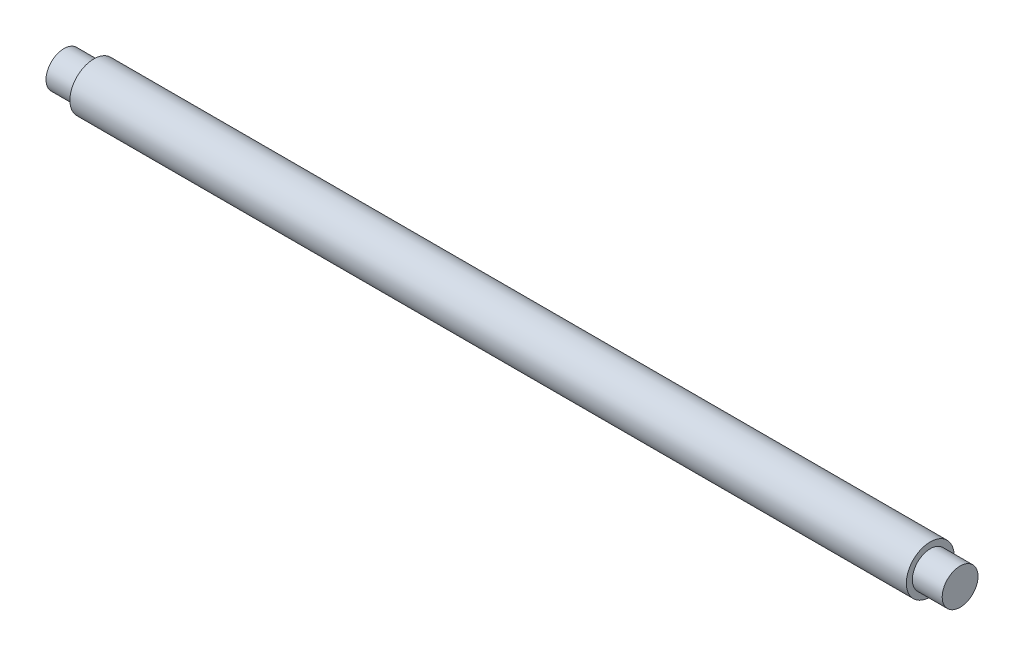
ISO-10303-21;
HEADER;
FILE_DESCRIPTION(('STEP AP214'),'2;1');
FILE_NAME('part.step','',(''),(''),'','','');
FILE_SCHEMA(('AUTOMOTIVE_DESIGN { 1 0 10303 214 1 1 1 1 }'));
ENDSEC;
DATA;
#1=APPLICATION_CONTEXT('core data for automotive mechanical design processes');
#2=APPLICATION_PROTOCOL_DEFINITION('international standard','automotive_design',2000,#1);
#3=PRODUCT_CONTEXT('',#1,'mechanical');
#4=PRODUCT('Part','Part','',(#3));
#5=PRODUCT_RELATED_PRODUCT_CATEGORY('part','',(#4));
#6=PRODUCT_DEFINITION_FORMATION('','',#4);
#7=PRODUCT_DEFINITION_CONTEXT('part definition',#1,'design');
#8=PRODUCT_DEFINITION('design','',#6,#7);
#9=PRODUCT_DEFINITION_SHAPE('','',#8);
#10=(LENGTH_UNIT() NAMED_UNIT(*) SI_UNIT(.MILLI.,.METRE.));
#11=(NAMED_UNIT(*) PLANE_ANGLE_UNIT() SI_UNIT($,.RADIAN.));
#12=(NAMED_UNIT(*) SI_UNIT($,.STERADIAN.) SOLID_ANGLE_UNIT());
#13=UNCERTAINTY_MEASURE_WITH_UNIT(LENGTH_MEASURE(1.E-05),#10,'distance_accuracy_value','');
#14=(GEOMETRIC_REPRESENTATION_CONTEXT(3) GLOBAL_UNCERTAINTY_ASSIGNED_CONTEXT((#13)) GLOBAL_UNIT_ASSIGNED_CONTEXT((#10,
#11,#12)) REPRESENTATION_CONTEXT('',''));
#15=CARTESIAN_POINT('',(0.,0.,0.));
#16=DIRECTION('',(0.,0.,1.));
#17=DIRECTION('',(1.,0.,0.));
#18=AXIS2_PLACEMENT_3D('',#15,#16,#17);
#19=CARTESIAN_POINT('',(-203.98406374502,0.,0.));
#20=DIRECTION('',(1.,0.,0.));
#21=DIRECTION('',(0.,0.,-1.));
#22=AXIS2_PLACEMENT_3D('',#19,#20,#21);
#23=PLANE('',#22);
#24=CARTESIAN_POINT('',(-203.98406374502,0.,0.));
#25=DIRECTION('',(-1.,0.,0.));
#26=DIRECTION('',(0.,0.,1.));
#27=AXIS2_PLACEMENT_3D('',#24,#25,#26);
#28=CIRCLE('',#27,3.);
#29=CARTESIAN_POINT('',(-203.98406374502,0.,3.));
#30=VERTEX_POINT('',#29);
#31=EDGE_CURVE('E10',#30,#30,#28,.T.);
#32=ORIENTED_EDGE('',*,*,#31,.T.);
#33=EDGE_LOOP('',(#32));
#34=FACE_BOUND('',#33,.T.);
#35=ADVANCED_FACE('F31',(#34),#23,.F.);
#36=CARTESIAN_POINT('',(-203.98406374502,0.,0.));
#37=DIRECTION('',(-1.,0.,0.));
#38=DIRECTION('',(0.,0.,1.));
#39=AXIS2_PLACEMENT_3D('',#36,#37,#38);
#40=CYLINDRICAL_SURFACE('',#39,3.);
#41=ORIENTED_EDGE('',*,*,#31,.F.);
#42=EDGE_LOOP('',(#41));
#43=FACE_BOUND('',#42,.T.);
#44=CARTESIAN_POINT('',(-198.98406374502,0.,0.));
#45=DIRECTION('',(-1.,0.,0.));
#46=DIRECTION('',(0.,0.,1.));
#47=AXIS2_PLACEMENT_3D('',#44,#45,#46);
#48=CIRCLE('',#47,3.);
#49=CARTESIAN_POINT('',(-198.98406374502,0.,3.));
#50=VERTEX_POINT('',#49);
#51=EDGE_CURVE('E37',#50,#50,#48,.T.);
#52=ORIENTED_EDGE('',*,*,#51,.T.);
#53=EDGE_LOOP('',(#52));
#54=FACE_BOUND('',#53,.T.);
#55=ADVANCED_FACE('F69',(#43,#54),#40,.T.);
#56=CARTESIAN_POINT('',(-198.98406374502,0.,-3.));
#57=DIRECTION('',(1.,0.,0.));
#58=DIRECTION('',(0.,0.,-1.));
#59=AXIS2_PLACEMENT_3D('',#56,#57,#58);
#60=PLANE('',#59);
#61=ORIENTED_EDGE('',*,*,#51,.F.);
#62=EDGE_LOOP('',(#61));
#63=FACE_BOUND('',#62,.T.);
#64=CARTESIAN_POINT('',(-198.98406374502,0.,0.));
#65=DIRECTION('',(-1.,0.,0.));
#66=DIRECTION('',(0.,0.,1.));
#67=AXIS2_PLACEMENT_3D('',#64,#65,#66);
#68=CIRCLE('',#67,4.);
#69=CARTESIAN_POINT('',(-198.98406374502,0.,4.));
#70=VERTEX_POINT('',#69);
#71=EDGE_CURVE('E41',#70,#70,#68,.T.);
#72=ORIENTED_EDGE('',*,*,#71,.T.);
#73=EDGE_LOOP('',(#72));
#74=FACE_BOUND('',#73,.T.);
#75=ADVANCED_FACE('F73',(#63,#74),#60,.F.);
#76=CARTESIAN_POINT('',(-203.98406374502,0.,0.));
#77=DIRECTION('',(-1.,0.,0.));
#78=DIRECTION('',(0.,0.,1.));
#79=AXIS2_PLACEMENT_3D('',#76,#77,#78);
#80=CYLINDRICAL_SURFACE('',#79,4.);
#81=ORIENTED_EDGE('',*,*,#71,.F.);
#82=EDGE_LOOP('',(#81));
#83=FACE_BOUND('',#82,.T.);
#84=CARTESIAN_POINT('',(-58.98406374502,0.,0.));
#85=DIRECTION('',(-1.,0.,0.));
#86=DIRECTION('',(0.,0.,1.));
#87=AXIS2_PLACEMENT_3D('',#84,#85,#86);
#88=CIRCLE('',#87,4.);
#89=CARTESIAN_POINT('',(-58.98406374502,0.,4.));
#90=VERTEX_POINT('',#89);
#91=EDGE_CURVE('E45',#90,#90,#88,.T.);
#92=ORIENTED_EDGE('',*,*,#91,.T.);
#93=EDGE_LOOP('',(#92));
#94=FACE_BOUND('',#93,.T.);
#95=ADVANCED_FACE('F78',(#83,#94),#80,.T.);
#96=CARTESIAN_POINT('',(-58.98406374502,0.,-4.));
#97=DIRECTION('',(-1.,0.,0.));
#98=DIRECTION('',(0.,0.,1.));
#99=AXIS2_PLACEMENT_3D('',#96,#97,#98);
#100=PLANE('',#99);
#101=ORIENTED_EDGE('',*,*,#91,.F.);
#102=EDGE_LOOP('',(#101));
#103=FACE_BOUND('',#102,.T.);
#104=CARTESIAN_POINT('',(-58.98406374502,0.,0.));
#105=DIRECTION('',(-1.,0.,0.));
#106=DIRECTION('',(0.,0.,1.));
#107=AXIS2_PLACEMENT_3D('',#104,#105,#106);
#108=CIRCLE('',#107,3.);
#109=CARTESIAN_POINT('',(-58.98406374502,0.,3.));
#110=VERTEX_POINT('',#109);
#111=EDGE_CURVE('E50',#110,#110,#108,.T.);
#112=ORIENTED_EDGE('',*,*,#111,.T.);
#113=EDGE_LOOP('',(#112));
#114=FACE_BOUND('',#113,.T.);
#115=ADVANCED_FACE('F65',(#103,#114),#100,.F.);
#116=CARTESIAN_POINT('',(-203.98406374502,0.,0.));
#117=DIRECTION('',(-1.,0.,0.));
#118=DIRECTION('',(0.,0.,1.));
#119=AXIS2_PLACEMENT_3D('',#116,#117,#118);
#120=CYLINDRICAL_SURFACE('',#119,3.);
#121=ORIENTED_EDGE('',*,*,#111,.F.);
#122=EDGE_LOOP('',(#121));
#123=FACE_BOUND('',#122,.T.);
#124=CARTESIAN_POINT('',(-53.98406374502,0.,0.));
#125=DIRECTION('',(-1.,0.,0.));
#126=DIRECTION('',(0.,0.,1.));
#127=AXIS2_PLACEMENT_3D('',#124,#125,#126);
#128=CIRCLE('',#127,3.);
#129=CARTESIAN_POINT('',(-53.98406374502,0.,3.));
#130=VERTEX_POINT('',#129);
#131=EDGE_CURVE('E53',#130,#130,#128,.T.);
#132=ORIENTED_EDGE('',*,*,#131,.T.);
#133=EDGE_LOOP('',(#132));
#134=FACE_BOUND('',#133,.T.);
#135=ADVANCED_FACE('F57',(#123,#134),#120,.T.);
#136=CARTESIAN_POINT('',(-53.98406374502,0.,-3.));
#137=DIRECTION('',(-1.,0.,0.));
#138=DIRECTION('',(0.,0.,1.));
#139=AXIS2_PLACEMENT_3D('',#136,#137,#138);
#140=PLANE('',#139);
#141=ORIENTED_EDGE('',*,*,#131,.F.);
#142=EDGE_LOOP('',(#141));
#143=FACE_BOUND('',#142,.T.);
#144=ADVANCED_FACE('F59',(#143),#140,.F.);
#145=CLOSED_SHELL('',(#35,#55,#75,#95,#115,#135,#144));
#146=MANIFOLD_SOLID_BREP('B2',#145);
#147=ADVANCED_BREP_SHAPE_REPRESENTATION('',(#18,#146),#14);
#148=SHAPE_DEFINITION_REPRESENTATION(#9,#147);
ENDSEC;
END-ISO-10303-21;
